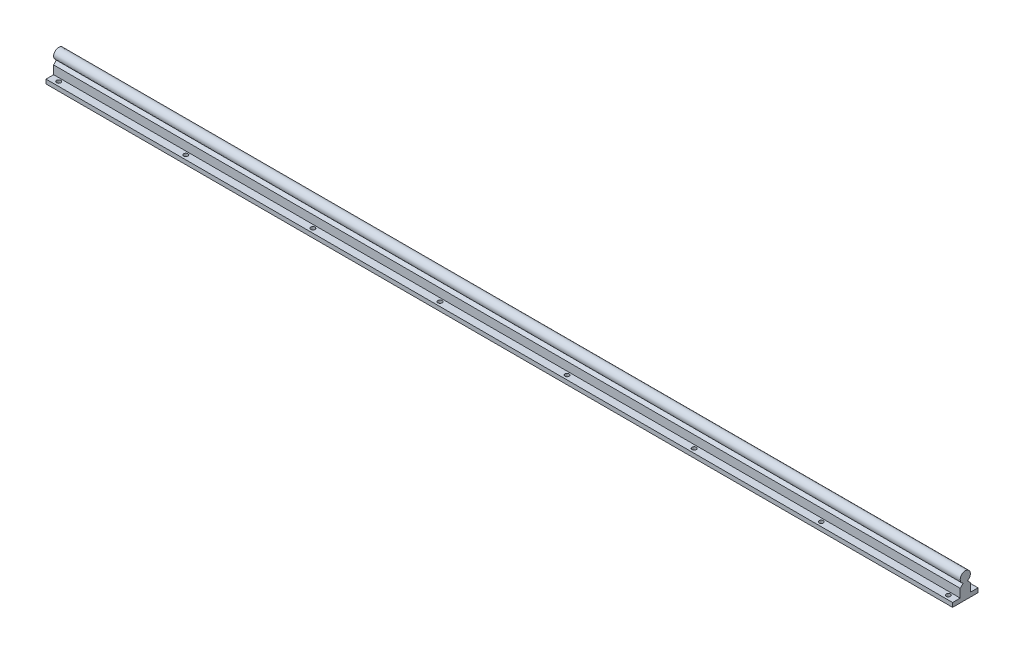
ISO-10303-21;
HEADER;
FILE_DESCRIPTION(('STEP AP214'),'2;1');
FILE_NAME('part.step','',(''),(''),'','','');
FILE_SCHEMA(('AUTOMOTIVE_DESIGN { 1 0 10303 214 1 1 1 1 }'));
ENDSEC;
DATA;
#1=APPLICATION_CONTEXT('core data for automotive mechanical design processes');
#2=APPLICATION_PROTOCOL_DEFINITION('international standard','automotive_design',2000,#1);
#3=PRODUCT_CONTEXT('',#1,'mechanical');
#4=PRODUCT('Part','Part','',(#3));
#5=PRODUCT_RELATED_PRODUCT_CATEGORY('part','',(#4));
#6=PRODUCT_DEFINITION_FORMATION('','',#4);
#7=PRODUCT_DEFINITION_CONTEXT('part definition',#1,'design');
#8=PRODUCT_DEFINITION('design','',#6,#7);
#9=PRODUCT_DEFINITION_SHAPE('','',#8);
#10=(LENGTH_UNIT() NAMED_UNIT(*) SI_UNIT(.MILLI.,.METRE.));
#11=(NAMED_UNIT(*) PLANE_ANGLE_UNIT() SI_UNIT($,.RADIAN.));
#12=(NAMED_UNIT(*) SI_UNIT($,.STERADIAN.) SOLID_ANGLE_UNIT());
#13=UNCERTAINTY_MEASURE_WITH_UNIT(LENGTH_MEASURE(1.E-05),#10,'distance_accuracy_value','');
#14=(GEOMETRIC_REPRESENTATION_CONTEXT(3) GLOBAL_UNCERTAINTY_ASSIGNED_CONTEXT((#13)) GLOBAL_UNIT_ASSIGNED_CONTEXT((#10,
#11,#12)) REPRESENTATION_CONTEXT('',''));
#15=CARTESIAN_POINT('',(0.,0.,0.));
#16=DIRECTION('',(0.,0.,1.));
#17=DIRECTION('',(1.,0.,0.));
#18=AXIS2_PLACEMENT_3D('',#15,#16,#17);
#19=CARTESIAN_POINT('',(525.,1070.,-10.0000000000001));
#20=DIRECTION('',(0.,-1.,0.));
#21=DIRECTION('',(0.,0.,-1.));
#22=AXIS2_PLACEMENT_3D('',#19,#20,#21);
#23=CYLINDRICAL_SURFACE('',#22,2.49999999999991);
#24=CARTESIAN_POINT('',(525.,4.99999999999989,-10.0000000000001));
#25=DIRECTION('',(0.,1.,0.));
#26=DIRECTION('',(0.,0.,1.));
#27=AXIS2_PLACEMENT_3D('',#24,#25,#26);
#28=CIRCLE('',#27,2.49999999999991);
#29=CARTESIAN_POINT('',(525.,4.99999999999989,-7.50000000000015));
#30=VERTEX_POINT('',#29);
#31=EDGE_CURVE('E49',#30,#30,#28,.T.);
#32=ORIENTED_EDGE('',*,*,#31,.T.);
#33=EDGE_LOOP('',(#32));
#34=FACE_BOUND('',#33,.T.);
#35=CARTESIAN_POINT('',(525.,0.,-10.0000000000001));
#36=DIRECTION('',(0.,-1.,0.));
#37=DIRECTION('',(0.,0.,-1.));
#38=AXIS2_PLACEMENT_3D('',#35,#36,#37);
#39=CIRCLE('',#38,2.49999999999991);
#40=CARTESIAN_POINT('',(525.,0.,-12.5));
#41=VERTEX_POINT('',#40);
#42=EDGE_CURVE('E11',#41,#41,#39,.T.);
#43=ORIENTED_EDGE('',*,*,#42,.T.);
#44=EDGE_LOOP('',(#43));
#45=FACE_BOUND('',#44,.T.);
#46=ADVANCED_FACE('F40',(#34,#45),#23,.F.);
#47=CARTESIAN_POINT('',(375.,1070.,-10.0000000000001));
#48=DIRECTION('',(0.,-1.,0.));
#49=DIRECTION('',(0.,0.,-1.));
#50=AXIS2_PLACEMENT_3D('',#47,#48,#49);
#51=CYLINDRICAL_SURFACE('',#50,2.49999999999991);
#52=CARTESIAN_POINT('',(375.,4.99999999999989,-10.0000000000001));
#53=DIRECTION('',(0.,1.,0.));
#54=DIRECTION('',(0.,0.,1.));
#55=AXIS2_PLACEMENT_3D('',#52,#53,#54);
#56=CIRCLE('',#55,2.49999999999991);
#57=CARTESIAN_POINT('',(375.,4.99999999999989,-7.50000000000015));
#58=VERTEX_POINT('',#57);
#59=EDGE_CURVE('E308',#58,#58,#56,.T.);
#60=ORIENTED_EDGE('',*,*,#59,.T.);
#61=EDGE_LOOP('',(#60));
#62=FACE_BOUND('',#61,.T.);
#63=CARTESIAN_POINT('',(375.,0.,-10.0000000000001));
#64=DIRECTION('',(0.,-1.,0.));
#65=DIRECTION('',(0.,0.,-1.));
#66=AXIS2_PLACEMENT_3D('',#63,#64,#65);
#67=CIRCLE('',#66,2.49999999999991);
#68=CARTESIAN_POINT('',(375.,0.,-12.5));
#69=VERTEX_POINT('',#68);
#70=EDGE_CURVE('E312',#69,#69,#67,.T.);
#71=ORIENTED_EDGE('',*,*,#70,.T.);
#72=EDGE_LOOP('',(#71));
#73=FACE_BOUND('',#72,.T.);
#74=ADVANCED_FACE('F339',(#62,#73),#51,.F.);
#75=CARTESIAN_POINT('',(225.,1070.,-10.0000000000001));
#76=DIRECTION('',(0.,-1.,0.));
#77=DIRECTION('',(0.,0.,-1.));
#78=AXIS2_PLACEMENT_3D('',#75,#76,#77);
#79=CYLINDRICAL_SURFACE('',#78,2.49999999999991);
#80=CARTESIAN_POINT('',(225.,4.99999999999989,-10.0000000000001));
#81=DIRECTION('',(0.,1.,0.));
#82=DIRECTION('',(0.,0.,1.));
#83=AXIS2_PLACEMENT_3D('',#80,#81,#82);
#84=CIRCLE('',#83,2.49999999999991);
#85=CARTESIAN_POINT('',(225.,4.99999999999989,-7.50000000000015));
#86=VERTEX_POINT('',#85);
#87=EDGE_CURVE('E300',#86,#86,#84,.T.);
#88=ORIENTED_EDGE('',*,*,#87,.T.);
#89=EDGE_LOOP('',(#88));
#90=FACE_BOUND('',#89,.T.);
#91=CARTESIAN_POINT('',(225.,0.,-10.0000000000001));
#92=DIRECTION('',(0.,-1.,0.));
#93=DIRECTION('',(0.,0.,-1.));
#94=AXIS2_PLACEMENT_3D('',#91,#92,#93);
#95=CIRCLE('',#94,2.49999999999991);
#96=CARTESIAN_POINT('',(225.,0.,-12.5));
#97=VERTEX_POINT('',#96);
#98=EDGE_CURVE('E304',#97,#97,#95,.T.);
#99=ORIENTED_EDGE('',*,*,#98,.T.);
#100=EDGE_LOOP('',(#99));
#101=FACE_BOUND('',#100,.T.);
#102=ADVANCED_FACE('F343',(#90,#101),#79,.F.);
#103=CARTESIAN_POINT('',(75.,1070.,-10.0000000000001));
#104=DIRECTION('',(0.,-1.,0.));
#105=DIRECTION('',(0.,0.,-1.));
#106=AXIS2_PLACEMENT_3D('',#103,#104,#105);
#107=CYLINDRICAL_SURFACE('',#106,2.49999999999991);
#108=CARTESIAN_POINT('',(75.,4.99999999999989,-10.0000000000001));
#109=DIRECTION('',(0.,1.,0.));
#110=DIRECTION('',(0.,0.,1.));
#111=AXIS2_PLACEMENT_3D('',#108,#109,#110);
#112=CIRCLE('',#111,2.49999999999991);
#113=CARTESIAN_POINT('',(75.,4.99999999999989,-7.50000000000015));
#114=VERTEX_POINT('',#113);
#115=EDGE_CURVE('E292',#114,#114,#112,.T.);
#116=ORIENTED_EDGE('',*,*,#115,.T.);
#117=EDGE_LOOP('',(#116));
#118=FACE_BOUND('',#117,.T.);
#119=CARTESIAN_POINT('',(75.,0.,-10.0000000000001));
#120=DIRECTION('',(0.,-1.,0.));
#121=DIRECTION('',(0.,0.,-1.));
#122=AXIS2_PLACEMENT_3D('',#119,#120,#121);
#123=CIRCLE('',#122,2.49999999999991);
#124=CARTESIAN_POINT('',(75.,0.,-12.5));
#125=VERTEX_POINT('',#124);
#126=EDGE_CURVE('E296',#125,#125,#123,.T.);
#127=ORIENTED_EDGE('',*,*,#126,.T.);
#128=EDGE_LOOP('',(#127));
#129=FACE_BOUND('',#128,.T.);
#130=ADVANCED_FACE('F348',(#118,#129),#107,.F.);
#131=CARTESIAN_POINT('',(-75.0000000000001,1070.,-10.0000000000001));
#132=DIRECTION('',(0.,-1.,0.));
#133=DIRECTION('',(0.,0.,-1.));
#134=AXIS2_PLACEMENT_3D('',#131,#132,#133);
#135=CYLINDRICAL_SURFACE('',#134,2.49999999999991);
#136=CARTESIAN_POINT('',(-75.0000000000001,4.99999999999989,-10.0000000000001));
#137=DIRECTION('',(0.,1.,0.));
#138=DIRECTION('',(0.,0.,1.));
#139=AXIS2_PLACEMENT_3D('',#136,#137,#138);
#140=CIRCLE('',#139,2.49999999999991);
#141=CARTESIAN_POINT('',(-75.0000000000001,4.99999999999989,-7.50000000000015));
#142=VERTEX_POINT('',#141);
#143=EDGE_CURVE('E284',#142,#142,#140,.T.);
#144=ORIENTED_EDGE('',*,*,#143,.T.);
#145=EDGE_LOOP('',(#144));
#146=FACE_BOUND('',#145,.T.);
#147=CARTESIAN_POINT('',(-75.0000000000001,0.,-10.0000000000001));
#148=DIRECTION('',(0.,-1.,0.));
#149=DIRECTION('',(0.,0.,-1.));
#150=AXIS2_PLACEMENT_3D('',#147,#148,#149);
#151=CIRCLE('',#150,2.49999999999991);
#152=CARTESIAN_POINT('',(-75.0000000000001,0.,-12.5));
#153=VERTEX_POINT('',#152);
#154=EDGE_CURVE('E288',#153,#153,#151,.T.);
#155=ORIENTED_EDGE('',*,*,#154,.T.);
#156=EDGE_LOOP('',(#155));
#157=FACE_BOUND('',#156,.T.);
#158=ADVANCED_FACE('F355',(#146,#157),#135,.F.);
#159=CARTESIAN_POINT('',(-225.,1070.,-10.0000000000001));
#160=DIRECTION('',(0.,-1.,0.));
#161=DIRECTION('',(0.,0.,-1.));
#162=AXIS2_PLACEMENT_3D('',#159,#160,#161);
#163=CYLINDRICAL_SURFACE('',#162,2.49999999999991);
#164=CARTESIAN_POINT('',(-225.,4.99999999999989,-10.0000000000001));
#165=DIRECTION('',(0.,1.,0.));
#166=DIRECTION('',(0.,0.,1.));
#167=AXIS2_PLACEMENT_3D('',#164,#165,#166);
#168=CIRCLE('',#167,2.49999999999991);
#169=CARTESIAN_POINT('',(-225.,4.99999999999989,-7.50000000000015));
#170=VERTEX_POINT('',#169);
#171=EDGE_CURVE('E276',#170,#170,#168,.T.);
#172=ORIENTED_EDGE('',*,*,#171,.T.);
#173=EDGE_LOOP('',(#172));
#174=FACE_BOUND('',#173,.T.);
#175=CARTESIAN_POINT('',(-225.,0.,-10.0000000000001));
#176=DIRECTION('',(0.,-1.,0.));
#177=DIRECTION('',(0.,0.,-1.));
#178=AXIS2_PLACEMENT_3D('',#175,#176,#177);
#179=CIRCLE('',#178,2.49999999999991);
#180=CARTESIAN_POINT('',(-225.,0.,-12.5));
#181=VERTEX_POINT('',#180);
#182=EDGE_CURVE('E280',#181,#181,#179,.T.);
#183=ORIENTED_EDGE('',*,*,#182,.T.);
#184=EDGE_LOOP('',(#183));
#185=FACE_BOUND('',#184,.T.);
#186=ADVANCED_FACE('F359',(#174,#185),#163,.F.);
#187=CARTESIAN_POINT('',(525.,1070.,9.99999999999994));
#188=DIRECTION('',(0.,-1.,0.));
#189=DIRECTION('',(0.,0.,-1.));
#190=AXIS2_PLACEMENT_3D('',#187,#188,#189);
#191=CYLINDRICAL_SURFACE('',#190,2.49999999999991);
#192=CARTESIAN_POINT('',(525.,4.99999999999989,9.99999999999994));
#193=DIRECTION('',(0.,1.,0.));
#194=DIRECTION('',(0.,0.,1.));
#195=AXIS2_PLACEMENT_3D('',#192,#193,#194);
#196=CIRCLE('',#195,2.49999999999991);
#197=CARTESIAN_POINT('',(525.,4.99999999999989,12.4999999999998));
#198=VERTEX_POINT('',#197);
#199=EDGE_CURVE('E268',#198,#198,#196,.T.);
#200=ORIENTED_EDGE('',*,*,#199,.T.);
#201=EDGE_LOOP('',(#200));
#202=FACE_BOUND('',#201,.T.);
#203=CARTESIAN_POINT('',(525.,0.,9.99999999999994));
#204=DIRECTION('',(0.,-1.,0.));
#205=DIRECTION('',(0.,0.,-1.));
#206=AXIS2_PLACEMENT_3D('',#203,#204,#205);
#207=CIRCLE('',#206,2.49999999999991);
#208=CARTESIAN_POINT('',(525.,0.,7.50000000000002));
#209=VERTEX_POINT('',#208);
#210=EDGE_CURVE('E272',#209,#209,#207,.T.);
#211=ORIENTED_EDGE('',*,*,#210,.T.);
#212=EDGE_LOOP('',(#211));
#213=FACE_BOUND('',#212,.T.);
#214=ADVANCED_FACE('F363',(#202,#213),#191,.F.);
#215=CARTESIAN_POINT('',(375.,1070.,9.99999999999994));
#216=DIRECTION('',(0.,-1.,0.));
#217=DIRECTION('',(0.,0.,-1.));
#218=AXIS2_PLACEMENT_3D('',#215,#216,#217);
#219=CYLINDRICAL_SURFACE('',#218,2.49999999999991);
#220=CARTESIAN_POINT('',(375.,4.99999999999989,9.99999999999994));
#221=DIRECTION('',(0.,1.,0.));
#222=DIRECTION('',(0.,0.,1.));
#223=AXIS2_PLACEMENT_3D('',#220,#221,#222);
#224=CIRCLE('',#223,2.49999999999991);
#225=CARTESIAN_POINT('',(375.,4.99999999999989,12.4999999999998));
#226=VERTEX_POINT('',#225);
#227=EDGE_CURVE('E260',#226,#226,#224,.T.);
#228=ORIENTED_EDGE('',*,*,#227,.T.);
#229=EDGE_LOOP('',(#228));
#230=FACE_BOUND('',#229,.T.);
#231=CARTESIAN_POINT('',(375.,0.,9.99999999999994));
#232=DIRECTION('',(0.,-1.,0.));
#233=DIRECTION('',(0.,0.,-1.));
#234=AXIS2_PLACEMENT_3D('',#231,#232,#233);
#235=CIRCLE('',#234,2.49999999999991);
#236=CARTESIAN_POINT('',(375.,0.,7.50000000000002));
#237=VERTEX_POINT('',#236);
#238=EDGE_CURVE('E264',#237,#237,#235,.T.);
#239=ORIENTED_EDGE('',*,*,#238,.T.);
#240=EDGE_LOOP('',(#239));
#241=FACE_BOUND('',#240,.T.);
#242=ADVANCED_FACE('F367',(#230,#241),#219,.F.);
#243=CARTESIAN_POINT('',(225.,1070.,9.99999999999994));
#244=DIRECTION('',(0.,-1.,0.));
#245=DIRECTION('',(0.,0.,-1.));
#246=AXIS2_PLACEMENT_3D('',#243,#244,#245);
#247=CYLINDRICAL_SURFACE('',#246,2.49999999999991);
#248=CARTESIAN_POINT('',(225.,4.99999999999989,9.99999999999994));
#249=DIRECTION('',(0.,1.,0.));
#250=DIRECTION('',(0.,0.,1.));
#251=AXIS2_PLACEMENT_3D('',#248,#249,#250);
#252=CIRCLE('',#251,2.49999999999991);
#253=CARTESIAN_POINT('',(225.,4.99999999999989,12.4999999999998));
#254=VERTEX_POINT('',#253);
#255=EDGE_CURVE('E252',#254,#254,#252,.T.);
#256=ORIENTED_EDGE('',*,*,#255,.T.);
#257=EDGE_LOOP('',(#256));
#258=FACE_BOUND('',#257,.T.);
#259=CARTESIAN_POINT('',(225.,0.,9.99999999999994));
#260=DIRECTION('',(0.,-1.,0.));
#261=DIRECTION('',(0.,0.,-1.));
#262=AXIS2_PLACEMENT_3D('',#259,#260,#261);
#263=CIRCLE('',#262,2.49999999999991);
#264=CARTESIAN_POINT('',(225.,0.,7.50000000000002));
#265=VERTEX_POINT('',#264);
#266=EDGE_CURVE('E256',#265,#265,#263,.T.);
#267=ORIENTED_EDGE('',*,*,#266,.T.);
#268=EDGE_LOOP('',(#267));
#269=FACE_BOUND('',#268,.T.);
#270=ADVANCED_FACE('F371',(#258,#269),#247,.F.);
#271=CARTESIAN_POINT('',(75.,1070.,9.99999999999994));
#272=DIRECTION('',(0.,-1.,0.));
#273=DIRECTION('',(0.,0.,-1.));
#274=AXIS2_PLACEMENT_3D('',#271,#272,#273);
#275=CYLINDRICAL_SURFACE('',#274,2.49999999999991);
#276=CARTESIAN_POINT('',(75.,4.99999999999989,9.99999999999994));
#277=DIRECTION('',(0.,1.,0.));
#278=DIRECTION('',(0.,0.,1.));
#279=AXIS2_PLACEMENT_3D('',#276,#277,#278);
#280=CIRCLE('',#279,2.49999999999991);
#281=CARTESIAN_POINT('',(75.,4.99999999999989,12.4999999999998));
#282=VERTEX_POINT('',#281);
#283=EDGE_CURVE('E244',#282,#282,#280,.T.);
#284=ORIENTED_EDGE('',*,*,#283,.T.);
#285=EDGE_LOOP('',(#284));
#286=FACE_BOUND('',#285,.T.);
#287=CARTESIAN_POINT('',(75.,0.,9.99999999999994));
#288=DIRECTION('',(0.,-1.,0.));
#289=DIRECTION('',(0.,0.,-1.));
#290=AXIS2_PLACEMENT_3D('',#287,#288,#289);
#291=CIRCLE('',#290,2.49999999999991);
#292=CARTESIAN_POINT('',(75.,0.,7.50000000000002));
#293=VERTEX_POINT('',#292);
#294=EDGE_CURVE('E248',#293,#293,#291,.T.);
#295=ORIENTED_EDGE('',*,*,#294,.T.);
#296=EDGE_LOOP('',(#295));
#297=FACE_BOUND('',#296,.T.);
#298=ADVANCED_FACE('F375',(#286,#297),#275,.F.);
#299=CARTESIAN_POINT('',(-75.0000000000001,1070.,9.99999999999994));
#300=DIRECTION('',(0.,-1.,0.));
#301=DIRECTION('',(0.,0.,-1.));
#302=AXIS2_PLACEMENT_3D('',#299,#300,#301);
#303=CYLINDRICAL_SURFACE('',#302,2.49999999999991);
#304=CARTESIAN_POINT('',(-75.0000000000001,4.99999999999989,9.99999999999994));
#305=DIRECTION('',(0.,1.,0.));
#306=DIRECTION('',(0.,0.,1.));
#307=AXIS2_PLACEMENT_3D('',#304,#305,#306);
#308=CIRCLE('',#307,2.49999999999991);
#309=CARTESIAN_POINT('',(-75.0000000000001,4.99999999999989,12.4999999999998));
#310=VERTEX_POINT('',#309);
#311=EDGE_CURVE('E236',#310,#310,#308,.T.);
#312=ORIENTED_EDGE('',*,*,#311,.T.);
#313=EDGE_LOOP('',(#312));
#314=FACE_BOUND('',#313,.T.);
#315=CARTESIAN_POINT('',(-75.0000000000001,0.,9.99999999999994));
#316=DIRECTION('',(0.,-1.,0.));
#317=DIRECTION('',(0.,0.,-1.));
#318=AXIS2_PLACEMENT_3D('',#315,#316,#317);
#319=CIRCLE('',#318,2.49999999999991);
#320=CARTESIAN_POINT('',(-75.0000000000001,0.,7.50000000000002));
#321=VERTEX_POINT('',#320);
#322=EDGE_CURVE('E240',#321,#321,#319,.T.);
#323=ORIENTED_EDGE('',*,*,#322,.T.);
#324=EDGE_LOOP('',(#323));
#325=FACE_BOUND('',#324,.T.);
#326=ADVANCED_FACE('F379',(#314,#325),#303,.F.);
#327=CARTESIAN_POINT('',(-225.,1070.,9.99999999999994));
#328=DIRECTION('',(0.,-1.,0.));
#329=DIRECTION('',(0.,0.,-1.));
#330=AXIS2_PLACEMENT_3D('',#327,#328,#329);
#331=CYLINDRICAL_SURFACE('',#330,2.49999999999991);
#332=CARTESIAN_POINT('',(-225.,4.99999999999989,9.99999999999994));
#333=DIRECTION('',(0.,1.,0.));
#334=DIRECTION('',(0.,0.,1.));
#335=AXIS2_PLACEMENT_3D('',#332,#333,#334);
#336=CIRCLE('',#335,2.49999999999991);
#337=CARTESIAN_POINT('',(-225.,4.99999999999989,12.4999999999998));
#338=VERTEX_POINT('',#337);
#339=EDGE_CURVE('E199',#338,#338,#336,.T.);
#340=ORIENTED_EDGE('',*,*,#339,.T.);
#341=EDGE_LOOP('',(#340));
#342=FACE_BOUND('',#341,.T.);
#343=CARTESIAN_POINT('',(-225.,0.,9.99999999999994));
#344=DIRECTION('',(0.,-1.,0.));
#345=DIRECTION('',(0.,0.,-1.));
#346=AXIS2_PLACEMENT_3D('',#343,#344,#345);
#347=CIRCLE('',#346,2.49999999999991);
#348=CARTESIAN_POINT('',(-225.,0.,7.50000000000002));
#349=VERTEX_POINT('',#348);
#350=EDGE_CURVE('E232',#349,#349,#347,.T.);
#351=ORIENTED_EDGE('',*,*,#350,.T.);
#352=EDGE_LOOP('',(#351));
#353=FACE_BOUND('',#352,.T.);
#354=ADVANCED_FACE('F383',(#342,#353),#331,.F.);
#355=CARTESIAN_POINT('',(-535.,5.,-15.));
#356=DIRECTION('',(0.,0.,-1.));
#357=DIRECTION('',(-1.,0.,0.));
#358=AXIS2_PLACEMENT_3D('',#355,#356,#357);
#359=PLANE('',#358);
#360=DIRECTION('',(0.,1.,0.));
#361=VECTOR('',#360,1.);
#362=CARTESIAN_POINT('',(535.,5.,-15.));
#363=LINE('',#362,#361);
#364=CARTESIAN_POINT('',(535.,0.,-15.));
#365=VERTEX_POINT('',#364);
#366=CARTESIAN_POINT('',(535.,5.,-15.));
#367=VERTEX_POINT('',#366);
#368=EDGE_CURVE('E158',#365,#367,#363,.T.);
#369=ORIENTED_EDGE('',*,*,#368,.F.);
#370=DIRECTION('',(1.,0.,0.));
#371=VECTOR('',#370,1.);
#372=CARTESIAN_POINT('',(-535.,0.,-15.));
#373=LINE('',#372,#371);
#374=CARTESIAN_POINT('',(-535.,0.,-15.));
#375=VERTEX_POINT('',#374);
#376=EDGE_CURVE('E57',#375,#365,#373,.T.);
#377=ORIENTED_EDGE('',*,*,#376,.F.);
#378=DIRECTION('',(0.,1.,0.));
#379=VECTOR('',#378,1.);
#380=CARTESIAN_POINT('',(-535.,5.,-15.));
#381=LINE('',#380,#379);
#382=CARTESIAN_POINT('',(-535.,5.,-15.));
#383=VERTEX_POINT('',#382);
#384=EDGE_CURVE('E196',#375,#383,#381,.T.);
#385=ORIENTED_EDGE('',*,*,#384,.T.);
#386=DIRECTION('',(1.,0.,0.));
#387=VECTOR('',#386,1.);
#388=CARTESIAN_POINT('',(-535.,5.,-15.));
#389=LINE('',#388,#387);
#390=EDGE_CURVE('E104',#383,#367,#389,.T.);
#391=ORIENTED_EDGE('',*,*,#390,.T.);
#392=EDGE_LOOP('',(#369,#377,#385,#391));
#393=FACE_BOUND('',#392,.T.);
#394=ADVANCED_FACE('F386',(#393),#359,.T.);
#395=CARTESIAN_POINT('',(-535.,0.,15.));
#396=DIRECTION('',(0.,-1.,0.));
#397=DIRECTION('',(0.,0.,-1.));
#398=AXIS2_PLACEMENT_3D('',#395,#396,#397);
#399=PLANE('',#398);
#400=CARTESIAN_POINT('',(-375.,0.,-10.0000000000001));
#401=DIRECTION('',(0.,-1.,0.));
#402=DIRECTION('',(0.,0.,-1.));
#403=AXIS2_PLACEMENT_3D('',#400,#401,#402);
#404=CIRCLE('',#403,2.49999999999991);
#405=CARTESIAN_POINT('',(-375.,0.,-12.5));
#406=VERTEX_POINT('',#405);
#407=EDGE_CURVE('E473',#406,#406,#404,.T.);
#408=ORIENTED_EDGE('',*,*,#407,.F.);
#409=EDGE_LOOP('',(#408));
#410=FACE_BOUND('',#409,.T.);
#411=CARTESIAN_POINT('',(-375.,0.,9.99999999999994));
#412=DIRECTION('',(0.,-1.,0.));
#413=DIRECTION('',(0.,0.,-1.));
#414=AXIS2_PLACEMENT_3D('',#411,#412,#413);
#415=CIRCLE('',#414,2.49999999999991);
#416=CARTESIAN_POINT('',(-375.,0.,7.50000000000002));
#417=VERTEX_POINT('',#416);
#418=EDGE_CURVE('E462',#417,#417,#415,.T.);
#419=ORIENTED_EDGE('',*,*,#418,.F.);
#420=EDGE_LOOP('',(#419));
#421=FACE_BOUND('',#420,.T.);
#422=CARTESIAN_POINT('',(-525.,0.,9.99999999999994));
#423=DIRECTION('',(0.,-1.,0.));
#424=DIRECTION('',(0.,0.,-1.));
#425=AXIS2_PLACEMENT_3D('',#422,#423,#424);
#426=CIRCLE('',#425,2.49999999999991);
#427=CARTESIAN_POINT('',(-525.,0.,7.50000000000002));
#428=VERTEX_POINT('',#427);
#429=EDGE_CURVE('E225',#428,#428,#426,.T.);
#430=ORIENTED_EDGE('',*,*,#429,.F.);
#431=EDGE_LOOP('',(#430));
#432=FACE_BOUND('',#431,.T.);
#433=CARTESIAN_POINT('',(-525.,0.,-10.0000000000001));
#434=DIRECTION('',(0.,-1.,0.));
#435=DIRECTION('',(0.,0.,-1.));
#436=AXIS2_PLACEMENT_3D('',#433,#434,#435);
#437=CIRCLE('',#436,2.49999999999991);
#438=CARTESIAN_POINT('',(-525.,0.,-12.5));
#439=VERTEX_POINT('',#438);
#440=EDGE_CURVE('E458',#439,#439,#437,.T.);
#441=ORIENTED_EDGE('',*,*,#440,.F.);
#442=EDGE_LOOP('',(#441));
#443=FACE_BOUND('',#442,.T.);
#444=DIRECTION('',(0.,0.,-1.));
#445=VECTOR('',#444,1.);
#446=CARTESIAN_POINT('',(535.,0.,15.));
#447=LINE('',#446,#445);
#448=CARTESIAN_POINT('',(535.,0.,15.));
#449=VERTEX_POINT('',#448);
#450=EDGE_CURVE('E192',#449,#365,#447,.T.);
#451=ORIENTED_EDGE('',*,*,#450,.F.);
#452=DIRECTION('',(1.,0.,0.));
#453=VECTOR('',#452,1.);
#454=CARTESIAN_POINT('',(-535.,0.,15.));
#455=LINE('',#454,#453);
#456=CARTESIAN_POINT('',(-535.,0.,15.));
#457=VERTEX_POINT('',#456);
#458=EDGE_CURVE('E92',#457,#449,#455,.T.);
#459=ORIENTED_EDGE('',*,*,#458,.F.);
#460=DIRECTION('',(0.,0.,-1.));
#461=VECTOR('',#460,1.);
#462=CARTESIAN_POINT('',(-535.,0.,15.));
#463=LINE('',#462,#461);
#464=EDGE_CURVE('E143',#457,#375,#463,.T.);
#465=ORIENTED_EDGE('',*,*,#464,.T.);
#466=ORIENTED_EDGE('',*,*,#376,.T.);
#467=EDGE_LOOP('',(#451,#459,#465,#466));
#468=FACE_BOUND('',#467,.T.);
#469=ORIENTED_EDGE('',*,*,#350,.F.);
#470=EDGE_LOOP('',(#469));
#471=FACE_BOUND('',#470,.T.);
#472=ORIENTED_EDGE('',*,*,#322,.F.);
#473=EDGE_LOOP('',(#472));
#474=FACE_BOUND('',#473,.T.);
#475=ORIENTED_EDGE('',*,*,#294,.F.);
#476=EDGE_LOOP('',(#475));
#477=FACE_BOUND('',#476,.T.);
#478=ORIENTED_EDGE('',*,*,#266,.F.);
#479=EDGE_LOOP('',(#478));
#480=FACE_BOUND('',#479,.T.);
#481=ORIENTED_EDGE('',*,*,#238,.F.);
#482=EDGE_LOOP('',(#481));
#483=FACE_BOUND('',#482,.T.);
#484=ORIENTED_EDGE('',*,*,#210,.F.);
#485=EDGE_LOOP('',(#484));
#486=FACE_BOUND('',#485,.T.);
#487=ORIENTED_EDGE('',*,*,#182,.F.);
#488=EDGE_LOOP('',(#487));
#489=FACE_BOUND('',#488,.T.);
#490=ORIENTED_EDGE('',*,*,#154,.F.);
#491=EDGE_LOOP('',(#490));
#492=FACE_BOUND('',#491,.T.);
#493=ORIENTED_EDGE('',*,*,#126,.F.);
#494=EDGE_LOOP('',(#493));
#495=FACE_BOUND('',#494,.T.);
#496=ORIENTED_EDGE('',*,*,#98,.F.);
#497=EDGE_LOOP('',(#496));
#498=FACE_BOUND('',#497,.T.);
#499=ORIENTED_EDGE('',*,*,#70,.F.);
#500=EDGE_LOOP('',(#499));
#501=FACE_BOUND('',#500,.T.);
#502=ORIENTED_EDGE('',*,*,#42,.F.);
#503=EDGE_LOOP('',(#502));
#504=FACE_BOUND('',#503,.T.);
#505=ADVANCED_FACE('F389',(#410,#421,#432,#443,#468,#471,#474,#477,#480,#483,#486,#489,#492,
#495,#498,#501,#504),#399,.T.);
#506=CARTESIAN_POINT('',(-535.,5.,15.));
#507=DIRECTION('',(0.,0.,1.));
#508=DIRECTION('',(1.,0.,0.));
#509=AXIS2_PLACEMENT_3D('',#506,#507,#508);
#510=PLANE('',#509);
#511=DIRECTION('',(0.,-1.,0.));
#512=VECTOR('',#511,1.);
#513=CARTESIAN_POINT('',(535.,5.,15.));
#514=LINE('',#513,#512);
#515=CARTESIAN_POINT('',(535.,5.,15.));
#516=VERTEX_POINT('',#515);
#517=EDGE_CURVE('E129',#516,#449,#514,.T.);
#518=ORIENTED_EDGE('',*,*,#517,.F.);
#519=DIRECTION('',(1.,0.,0.));
#520=VECTOR('',#519,1.);
#521=CARTESIAN_POINT('',(-535.,5.,15.));
#522=LINE('',#521,#520);
#523=CARTESIAN_POINT('',(-535.,5.,15.));
#524=VERTEX_POINT('',#523);
#525=EDGE_CURVE('E124',#524,#516,#522,.T.);
#526=ORIENTED_EDGE('',*,*,#525,.F.);
#527=DIRECTION('',(0.,-1.,0.));
#528=VECTOR('',#527,1.);
#529=CARTESIAN_POINT('',(-535.,5.,15.));
#530=LINE('',#529,#528);
#531=EDGE_CURVE('E127',#524,#457,#530,.T.);
#532=ORIENTED_EDGE('',*,*,#531,.T.);
#533=ORIENTED_EDGE('',*,*,#458,.T.);
#534=EDGE_LOOP('',(#518,#526,#532,#533));
#535=FACE_BOUND('',#534,.T.);
#536=ADVANCED_FACE('F126',(#535),#510,.T.);
#537=CARTESIAN_POINT('',(-535.,5.,15.));
#538=DIRECTION('',(0.,1.,0.));
#539=DIRECTION('',(0.,0.,1.));
#540=AXIS2_PLACEMENT_3D('',#537,#538,#539);
#541=PLANE('',#540);
#542=CARTESIAN_POINT('',(-375.,4.99999999999989,9.99999999999994));
#543=DIRECTION('',(0.,1.,0.));
#544=DIRECTION('',(0.,0.,1.));
#545=AXIS2_PLACEMENT_3D('',#542,#543,#544);
#546=CIRCLE('',#545,2.49999999999991);
#547=CARTESIAN_POINT('',(-375.,4.99999999999989,12.4999999999998));
#548=VERTEX_POINT('',#547);
#549=EDGE_CURVE('E469',#548,#548,#546,.T.);
#550=ORIENTED_EDGE('',*,*,#549,.F.);
#551=EDGE_LOOP('',(#550));
#552=FACE_BOUND('',#551,.T.);
#553=CARTESIAN_POINT('',(-525.,4.99999999999989,9.99999999999994));
#554=DIRECTION('',(0.,1.,0.));
#555=DIRECTION('',(0.,0.,1.));
#556=AXIS2_PLACEMENT_3D('',#553,#554,#555);
#557=CIRCLE('',#556,2.49999999999991);
#558=CARTESIAN_POINT('',(-525.,4.99999999999989,12.4999999999998));
#559=VERTEX_POINT('',#558);
#560=EDGE_CURVE('E163',#559,#559,#557,.T.);
#561=ORIENTED_EDGE('',*,*,#560,.F.);
#562=EDGE_LOOP('',(#561));
#563=FACE_BOUND('',#562,.T.);
#564=DIRECTION('',(0.,0.,1.));
#565=VECTOR('',#564,1.);
#566=CARTESIAN_POINT('',(535.,5.,15.));
#567=LINE('',#566,#565);
#568=CARTESIAN_POINT('',(535.,5.,6.));
#569=VERTEX_POINT('',#568);
#570=EDGE_CURVE('E187',#569,#516,#567,.T.);
#571=ORIENTED_EDGE('',*,*,#570,.F.);
#572=DIRECTION('',(1.,0.,0.));
#573=VECTOR('',#572,1.);
#574=CARTESIAN_POINT('',(-535.,5.,6.));
#575=LINE('',#574,#573);
#576=CARTESIAN_POINT('',(-535.,5.,6.));
#577=VERTEX_POINT('',#576);
#578=EDGE_CURVE('E135',#577,#569,#575,.T.);
#579=ORIENTED_EDGE('',*,*,#578,.F.);
#580=DIRECTION('',(0.,0.,1.));
#581=VECTOR('',#580,1.);
#582=CARTESIAN_POINT('',(-535.,5.,15.));
#583=LINE('',#582,#581);
#584=EDGE_CURVE('E141',#577,#524,#583,.T.);
#585=ORIENTED_EDGE('',*,*,#584,.T.);
#586=ORIENTED_EDGE('',*,*,#525,.T.);
#587=EDGE_LOOP('',(#571,#579,#585,#586));
#588=FACE_BOUND('',#587,.T.);
#589=ORIENTED_EDGE('',*,*,#339,.F.);
#590=EDGE_LOOP('',(#589));
#591=FACE_BOUND('',#590,.T.);
#592=ORIENTED_EDGE('',*,*,#311,.F.);
#593=EDGE_LOOP('',(#592));
#594=FACE_BOUND('',#593,.T.);
#595=ORIENTED_EDGE('',*,*,#283,.F.);
#596=EDGE_LOOP('',(#595));
#597=FACE_BOUND('',#596,.T.);
#598=ORIENTED_EDGE('',*,*,#255,.F.);
#599=EDGE_LOOP('',(#598));
#600=FACE_BOUND('',#599,.T.);
#601=ORIENTED_EDGE('',*,*,#227,.F.);
#602=EDGE_LOOP('',(#601));
#603=FACE_BOUND('',#602,.T.);
#604=ORIENTED_EDGE('',*,*,#199,.F.);
#605=EDGE_LOOP('',(#604));
#606=FACE_BOUND('',#605,.T.);
#607=ADVANCED_FACE('F146',(#552,#563,#588,#591,#594,#597,#600,#603,#606),#541,.T.);
#608=CARTESIAN_POINT('',(-535.,15.,6.));
#609=DIRECTION('',(0.,0.,1.));
#610=DIRECTION('',(0.,-1.,0.));
#611=AXIS2_PLACEMENT_3D('',#608,#609,#610);
#612=PLANE('',#611);
#613=DIRECTION('',(0.,-1.,0.));
#614=VECTOR('',#613,1.);
#615=CARTESIAN_POINT('',(535.,15.,6.));
#616=LINE('',#615,#614);
#617=CARTESIAN_POINT('',(535.,15.,6.));
#618=VERTEX_POINT('',#617);
#619=EDGE_CURVE('E183',#618,#569,#616,.T.);
#620=ORIENTED_EDGE('',*,*,#619,.F.);
#621=DIRECTION('',(1.,0.,0.));
#622=VECTOR('',#621,1.);
#623=CARTESIAN_POINT('',(-535.,15.,6.));
#624=LINE('',#623,#622);
#625=CARTESIAN_POINT('',(-535.,15.,6.));
#626=VERTEX_POINT('',#625);
#627=EDGE_CURVE('E204',#626,#618,#624,.T.);
#628=ORIENTED_EDGE('',*,*,#627,.F.);
#629=DIRECTION('',(0.,-1.,0.));
#630=VECTOR('',#629,1.);
#631=CARTESIAN_POINT('',(-535.,15.,6.));
#632=LINE('',#631,#630);
#633=EDGE_CURVE('E149',#626,#577,#632,.T.);
#634=ORIENTED_EDGE('',*,*,#633,.T.);
#635=ORIENTED_EDGE('',*,*,#578,.T.);
#636=EDGE_LOOP('',(#620,#628,#634,#635));
#637=FACE_BOUND('',#636,.T.);
#638=ADVANCED_FACE('F433',(#637),#612,.T.);
#639=CARTESIAN_POINT('',(-535.,15.,6.));
#640=DIRECTION('',(0.,0.702511174954528,0.711672712041153));
#641=DIRECTION('',(0.,-0.711672712041153,0.702511174954528));
#642=AXIS2_PLACEMENT_3D('',#639,#640,#641);
#643=PLANE('',#642);
#644=DIRECTION('',(0.,-0.711672712041152,0.702511174954527));
#645=VECTOR('',#644,1.);
#646=CARTESIAN_POINT('',(535.,15.,6.));
#647=LINE('',#646,#645);
#648=CARTESIAN_POINT('',(535.,18.5456439426821,2.5));
#649=VERTEX_POINT('',#648);
#650=EDGE_CURVE('E179',#649,#618,#647,.T.);
#651=ORIENTED_EDGE('',*,*,#650,.F.);
#652=DIRECTION('',(1.,0.,0.));
#653=VECTOR('',#652,1.);
#654=CARTESIAN_POINT('',(-535.,18.5456439426821,2.5));
#655=LINE('',#654,#653);
#656=CARTESIAN_POINT('',(-535.,18.5456439426821,2.5));
#657=VERTEX_POINT('',#656);
#658=EDGE_CURVE('E207',#657,#649,#655,.T.);
#659=ORIENTED_EDGE('',*,*,#658,.F.);
#660=DIRECTION('',(0.,-0.711672712041152,0.702511174954527));
#661=VECTOR('',#660,1.);
#662=CARTESIAN_POINT('',(-535.,15.,6.));
#663=LINE('',#662,#661);
#664=EDGE_CURVE('E152',#657,#626,#663,.T.);
#665=ORIENTED_EDGE('',*,*,#664,.T.);
#666=ORIENTED_EDGE('',*,*,#627,.T.);
#667=EDGE_LOOP('',(#651,#659,#665,#666));
#668=FACE_BOUND('',#667,.T.);
#669=ADVANCED_FACE('F439',(#668),#643,.T.);
#670=CARTESIAN_POINT('',(-535.,24.,0.));
#671=DIRECTION('',(1.,0.,0.));
#672=DIRECTION('',(0.,0.,-1.));
#673=AXIS2_PLACEMENT_3D('',#670,#671,#672);
#674=CYLINDRICAL_SURFACE('',#673,6.);
#675=CARTESIAN_POINT('',(535.,24.,0.));
#676=DIRECTION('',(1.,0.,0.));
#677=DIRECTION('',(0.,0.,-1.));
#678=AXIS2_PLACEMENT_3D('',#675,#676,#677);
#679=CIRCLE('',#678,6.);
#680=CARTESIAN_POINT('',(535.,18.5456439426821,-2.5));
#681=VERTEX_POINT('',#680);
#682=EDGE_CURVE('E175',#681,#649,#679,.T.);
#683=ORIENTED_EDGE('',*,*,#682,.F.);
#684=DIRECTION('',(1.,0.,0.));
#685=VECTOR('',#684,1.);
#686=CARTESIAN_POINT('',(-535.,18.5456439426821,-2.5));
#687=LINE('',#686,#685);
#688=CARTESIAN_POINT('',(-535.,18.5456439426821,-2.5));
#689=VERTEX_POINT('',#688);
#690=EDGE_CURVE('E210',#689,#681,#687,.T.);
#691=ORIENTED_EDGE('',*,*,#690,.F.);
#692=CARTESIAN_POINT('',(-535.,24.,0.));
#693=DIRECTION('',(1.,0.,0.));
#694=DIRECTION('',(0.,0.,-1.));
#695=AXIS2_PLACEMENT_3D('',#692,#693,#694);
#696=CIRCLE('',#695,6.);
#697=EDGE_CURVE('E441',#689,#657,#696,.T.);
#698=ORIENTED_EDGE('',*,*,#697,.T.);
#699=ORIENTED_EDGE('',*,*,#658,.T.);
#700=EDGE_LOOP('',(#683,#691,#698,#699));
#701=FACE_BOUND('',#700,.T.);
#702=ADVANCED_FACE('F517',(#701),#674,.T.);
#703=CARTESIAN_POINT('',(-535.,15.,-6.));
#704=DIRECTION('',(0.,0.702511174954528,-0.711672712041153));
#705=DIRECTION('',(0.,0.711672712041153,0.702511174954528));
#706=AXIS2_PLACEMENT_3D('',#703,#704,#705);
#707=PLANE('',#706);
#708=DIRECTION('',(0.,0.711672712041152,0.702511174954527));
#709=VECTOR('',#708,1.);
#710=CARTESIAN_POINT('',(535.,15.,-6.));
#711=LINE('',#710,#709);
#712=CARTESIAN_POINT('',(535.,15.,-6.));
#713=VERTEX_POINT('',#712);
#714=EDGE_CURVE('E171',#713,#681,#711,.T.);
#715=ORIENTED_EDGE('',*,*,#714,.F.);
#716=DIRECTION('',(1.,0.,0.));
#717=VECTOR('',#716,1.);
#718=CARTESIAN_POINT('',(-535.,15.,-6.));
#719=LINE('',#718,#717);
#720=CARTESIAN_POINT('',(-535.,15.,-6.));
#721=VERTEX_POINT('',#720);
#722=EDGE_CURVE('E213',#721,#713,#719,.T.);
#723=ORIENTED_EDGE('',*,*,#722,.F.);
#724=DIRECTION('',(0.,0.711672712041152,0.702511174954527));
#725=VECTOR('',#724,1.);
#726=CARTESIAN_POINT('',(-535.,15.,-6.));
#727=LINE('',#726,#725);
#728=EDGE_CURVE('E443',#721,#689,#727,.T.);
#729=ORIENTED_EDGE('',*,*,#728,.T.);
#730=ORIENTED_EDGE('',*,*,#690,.T.);
#731=EDGE_LOOP('',(#715,#723,#729,#730));
#732=FACE_BOUND('',#731,.T.);
#733=ADVANCED_FACE('F332',(#732),#707,.T.);
#734=CARTESIAN_POINT('',(-535.,15.,-6.));
#735=DIRECTION('',(0.,0.,-1.));
#736=DIRECTION('',(0.,1.,0.));
#737=AXIS2_PLACEMENT_3D('',#734,#735,#736);
#738=PLANE('',#737);
#739=DIRECTION('',(0.,1.,0.));
#740=VECTOR('',#739,1.);
#741=CARTESIAN_POINT('',(535.,15.,-6.));
#742=LINE('',#741,#740);
#743=CARTESIAN_POINT('',(535.,5.,-6.));
#744=VERTEX_POINT('',#743);
#745=EDGE_CURVE('E167',#744,#713,#742,.T.);
#746=ORIENTED_EDGE('',*,*,#745,.F.);
#747=DIRECTION('',(1.,0.,0.));
#748=VECTOR('',#747,1.);
#749=CARTESIAN_POINT('',(-535.,5.,-6.));
#750=LINE('',#749,#748);
#751=CARTESIAN_POINT('',(-535.,5.,-6.));
#752=VERTEX_POINT('',#751);
#753=EDGE_CURVE('E216',#752,#744,#750,.T.);
#754=ORIENTED_EDGE('',*,*,#753,.F.);
#755=DIRECTION('',(0.,1.,0.));
#756=VECTOR('',#755,1.);
#757=CARTESIAN_POINT('',(-535.,15.,-6.));
#758=LINE('',#757,#756);
#759=EDGE_CURVE('E449',#752,#721,#758,.T.);
#760=ORIENTED_EDGE('',*,*,#759,.T.);
#761=ORIENTED_EDGE('',*,*,#722,.T.);
#762=EDGE_LOOP('',(#746,#754,#760,#761));
#763=FACE_BOUND('',#762,.T.);
#764=ADVANCED_FACE('F323',(#763),#738,.T.);
#765=CARTESIAN_POINT('',(-535.,5.,-6.));
#766=DIRECTION('',(0.,1.,0.));
#767=DIRECTION('',(0.,0.,1.));
#768=AXIS2_PLACEMENT_3D('',#765,#766,#767);
#769=PLANE('',#768);
#770=CARTESIAN_POINT('',(-375.,4.99999999999989,-10.0000000000001));
#771=DIRECTION('',(0.,1.,0.));
#772=DIRECTION('',(0.,0.,1.));
#773=AXIS2_PLACEMENT_3D('',#770,#771,#772);
#774=CIRCLE('',#773,2.49999999999991);
#775=CARTESIAN_POINT('',(-375.,4.99999999999989,-7.50000000000015));
#776=VERTEX_POINT('',#775);
#777=EDGE_CURVE('E477',#776,#776,#774,.T.);
#778=ORIENTED_EDGE('',*,*,#777,.F.);
#779=EDGE_LOOP('',(#778));
#780=FACE_BOUND('',#779,.T.);
#781=CARTESIAN_POINT('',(-525.,4.99999999999989,-10.0000000000001));
#782=DIRECTION('',(0.,1.,0.));
#783=DIRECTION('',(0.,0.,1.));
#784=AXIS2_PLACEMENT_3D('',#781,#782,#783);
#785=CIRCLE('',#784,2.49999999999991);
#786=CARTESIAN_POINT('',(-525.,4.99999999999989,-7.50000000000015));
#787=VERTEX_POINT('',#786);
#788=EDGE_CURVE('E221',#787,#787,#785,.T.);
#789=ORIENTED_EDGE('',*,*,#788,.F.);
#790=EDGE_LOOP('',(#789));
#791=FACE_BOUND('',#790,.T.);
#792=DIRECTION('',(0.,0.,1.));
#793=VECTOR('',#792,1.);
#794=CARTESIAN_POINT('',(535.,5.,-6.));
#795=LINE('',#794,#793);
#796=EDGE_CURVE('E162',#367,#744,#795,.T.);
#797=ORIENTED_EDGE('',*,*,#796,.F.);
#798=ORIENTED_EDGE('',*,*,#390,.F.);
#799=DIRECTION('',(0.,0.,1.));
#800=VECTOR('',#799,1.);
#801=CARTESIAN_POINT('',(-535.,5.,-6.));
#802=LINE('',#801,#800);
#803=EDGE_CURVE('E453',#383,#752,#802,.T.);
#804=ORIENTED_EDGE('',*,*,#803,.T.);
#805=ORIENTED_EDGE('',*,*,#753,.T.);
#806=EDGE_LOOP('',(#797,#798,#804,#805));
#807=FACE_BOUND('',#806,.T.);
#808=ORIENTED_EDGE('',*,*,#171,.F.);
#809=EDGE_LOOP('',(#808));
#810=FACE_BOUND('',#809,.T.);
#811=ORIENTED_EDGE('',*,*,#143,.F.);
#812=EDGE_LOOP('',(#811));
#813=FACE_BOUND('',#812,.T.);
#814=ORIENTED_EDGE('',*,*,#115,.F.);
#815=EDGE_LOOP('',(#814));
#816=FACE_BOUND('',#815,.T.);
#817=ORIENTED_EDGE('',*,*,#87,.F.);
#818=EDGE_LOOP('',(#817));
#819=FACE_BOUND('',#818,.T.);
#820=ORIENTED_EDGE('',*,*,#59,.F.);
#821=EDGE_LOOP('',(#820));
#822=FACE_BOUND('',#821,.T.);
#823=ORIENTED_EDGE('',*,*,#31,.F.);
#824=EDGE_LOOP('',(#823));
#825=FACE_BOUND('',#824,.T.);
#826=ADVANCED_FACE('F321',(#780,#791,#807,#810,#813,#816,#819,#822,#825),#769,.T.);
#827=CARTESIAN_POINT('',(-535.,24.,0.));
#828=DIRECTION('',(1.,0.,0.));
#829=DIRECTION('',(0.,0.,-1.));
#830=AXIS2_PLACEMENT_3D('',#827,#828,#829);
#831=PLANE('',#830);
#832=ORIENTED_EDGE('',*,*,#384,.F.);
#833=ORIENTED_EDGE('',*,*,#464,.F.);
#834=ORIENTED_EDGE('',*,*,#531,.F.);
#835=ORIENTED_EDGE('',*,*,#584,.F.);
#836=ORIENTED_EDGE('',*,*,#633,.F.);
#837=ORIENTED_EDGE('',*,*,#664,.F.);
#838=ORIENTED_EDGE('',*,*,#697,.F.);
#839=ORIENTED_EDGE('',*,*,#728,.F.);
#840=ORIENTED_EDGE('',*,*,#759,.F.);
#841=ORIENTED_EDGE('',*,*,#803,.F.);
#842=EDGE_LOOP('',(#832,#833,#834,#835,#836,#837,#838,#839,#840,#841));
#843=FACE_BOUND('',#842,.T.);
#844=ADVANCED_FACE('F139',(#843),#831,.F.);
#845=CARTESIAN_POINT('',(535.,24.,0.));
#846=DIRECTION('',(1.,0.,0.));
#847=DIRECTION('',(0.,0.,-1.));
#848=AXIS2_PLACEMENT_3D('',#845,#846,#847);
#849=PLANE('',#848);
#850=ORIENTED_EDGE('',*,*,#368,.T.);
#851=ORIENTED_EDGE('',*,*,#796,.T.);
#852=ORIENTED_EDGE('',*,*,#745,.T.);
#853=ORIENTED_EDGE('',*,*,#714,.T.);
#854=ORIENTED_EDGE('',*,*,#682,.T.);
#855=ORIENTED_EDGE('',*,*,#650,.T.);
#856=ORIENTED_EDGE('',*,*,#619,.T.);
#857=ORIENTED_EDGE('',*,*,#570,.T.);
#858=ORIENTED_EDGE('',*,*,#517,.T.);
#859=ORIENTED_EDGE('',*,*,#450,.T.);
#860=EDGE_LOOP('',(#850,#851,#852,#853,#854,#855,#856,#857,#858,#859));
#861=FACE_BOUND('',#860,.T.);
#862=ADVANCED_FACE('F330',(#861),#849,.T.);
#863=CARTESIAN_POINT('',(-525.,1070.,-10.0000000000001));
#864=DIRECTION('',(0.,-1.,0.));
#865=DIRECTION('',(0.,0.,-1.));
#866=AXIS2_PLACEMENT_3D('',#863,#864,#865);
#867=CYLINDRICAL_SURFACE('',#866,2.49999999999991);
#868=ORIENTED_EDGE('',*,*,#788,.T.);
#869=EDGE_LOOP('',(#868));
#870=FACE_BOUND('',#869,.T.);
#871=ORIENTED_EDGE('',*,*,#440,.T.);
#872=EDGE_LOOP('',(#871));
#873=FACE_BOUND('',#872,.T.);
#874=ADVANCED_FACE('F494',(#870,#873),#867,.F.);
#875=CARTESIAN_POINT('',(-525.,1070.,9.99999999999994));
#876=DIRECTION('',(0.,-1.,0.));
#877=DIRECTION('',(0.,0.,-1.));
#878=AXIS2_PLACEMENT_3D('',#875,#876,#877);
#879=CYLINDRICAL_SURFACE('',#878,2.49999999999991);
#880=ORIENTED_EDGE('',*,*,#560,.T.);
#881=EDGE_LOOP('',(#880));
#882=FACE_BOUND('',#881,.T.);
#883=ORIENTED_EDGE('',*,*,#429,.T.);
#884=EDGE_LOOP('',(#883));
#885=FACE_BOUND('',#884,.T.);
#886=ADVANCED_FACE('F496',(#882,#885),#879,.F.);
#887=CARTESIAN_POINT('',(-375.,1070.,9.99999999999994));
#888=DIRECTION('',(0.,-1.,0.));
#889=DIRECTION('',(0.,0.,-1.));
#890=AXIS2_PLACEMENT_3D('',#887,#888,#889);
#891=CYLINDRICAL_SURFACE('',#890,2.49999999999991);
#892=ORIENTED_EDGE('',*,*,#549,.T.);
#893=EDGE_LOOP('',(#892));
#894=FACE_BOUND('',#893,.T.);
#895=ORIENTED_EDGE('',*,*,#418,.T.);
#896=EDGE_LOOP('',(#895));
#897=FACE_BOUND('',#896,.T.);
#898=ADVANCED_FACE('F484',(#894,#897),#891,.F.);
#899=CARTESIAN_POINT('',(-375.,1070.,-10.0000000000001));
#900=DIRECTION('',(0.,-1.,0.));
#901=DIRECTION('',(0.,0.,-1.));
#902=AXIS2_PLACEMENT_3D('',#899,#900,#901);
#903=CYLINDRICAL_SURFACE('',#902,2.49999999999991);
#904=ORIENTED_EDGE('',*,*,#777,.T.);
#905=EDGE_LOOP('',(#904));
#906=FACE_BOUND('',#905,.T.);
#907=ORIENTED_EDGE('',*,*,#407,.T.);
#908=EDGE_LOOP('',(#907));
#909=FACE_BOUND('',#908,.T.);
#910=ADVANCED_FACE('F481',(#906,#909),#903,.F.);
#911=CLOSED_SHELL('',(#46,#74,#102,#130,#158,#186,#214,#242,#270,#298,#326,#354,#394,#505,#536,
#607,#638,#669,#702,#733,#764,#826,#844,#862,#874,#886,#898,#910));
#912=MANIFOLD_SOLID_BREP('B2',#911);
#913=ADVANCED_BREP_SHAPE_REPRESENTATION('',(#18,#912),#14);
#914=SHAPE_DEFINITION_REPRESENTATION(#9,#913);
ENDSEC;
END-ISO-10303-21;
